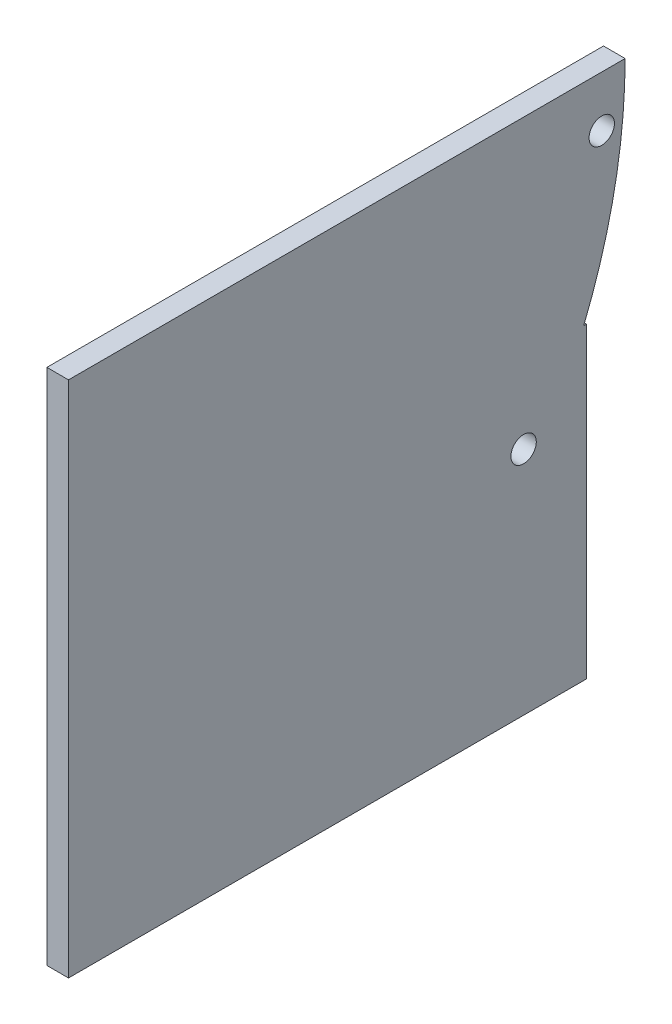
ISO-10303-21;
HEADER;
FILE_DESCRIPTION(('STEP AP214'),'2;1');
FILE_NAME('part.step','',(''),(''),'','','');
FILE_SCHEMA(('AUTOMOTIVE_DESIGN { 1 0 10303 214 1 1 1 1 }'));
ENDSEC;
DATA;
#1=APPLICATION_CONTEXT('core data for automotive mechanical design processes');
#2=APPLICATION_PROTOCOL_DEFINITION('international standard','automotive_design',2000,#1);
#3=PRODUCT_CONTEXT('',#1,'mechanical');
#4=PRODUCT('Part','Part','',(#3));
#5=PRODUCT_RELATED_PRODUCT_CATEGORY('part','',(#4));
#6=PRODUCT_DEFINITION_FORMATION('','',#4);
#7=PRODUCT_DEFINITION_CONTEXT('part definition',#1,'design');
#8=PRODUCT_DEFINITION('design','',#6,#7);
#9=PRODUCT_DEFINITION_SHAPE('','',#8);
#10=(LENGTH_UNIT() NAMED_UNIT(*) SI_UNIT(.MILLI.,.METRE.));
#11=(NAMED_UNIT(*) PLANE_ANGLE_UNIT() SI_UNIT($,.RADIAN.));
#12=(NAMED_UNIT(*) SI_UNIT($,.STERADIAN.) SOLID_ANGLE_UNIT());
#13=UNCERTAINTY_MEASURE_WITH_UNIT(LENGTH_MEASURE(1.E-05),#10,'distance_accuracy_value','');
#14=(GEOMETRIC_REPRESENTATION_CONTEXT(3) GLOBAL_UNCERTAINTY_ASSIGNED_CONTEXT((#13)) GLOBAL_UNIT_ASSIGNED_CONTEXT((#10,
#11,#12)) REPRESENTATION_CONTEXT('',''));
#15=CARTESIAN_POINT('',(0.,0.,0.));
#16=DIRECTION('',(0.,0.,1.));
#17=DIRECTION('',(1.,0.,0.));
#18=AXIS2_PLACEMENT_3D('',#15,#16,#17);
#19=CARTESIAN_POINT('',(5.4102,0.,0.));
#20=DIRECTION('',(0.,0.,-1.));
#21=DIRECTION('',(0.,1.,0.));
#22=AXIS2_PLACEMENT_3D('',#19,#20,#21);
#23=PLANE('',#22);
#24=DIRECTION('',(0.,-1.,0.));
#25=VECTOR('',#24,1.);
#26=CARTESIAN_POINT('',(0.,0.,0.));
#27=LINE('',#26,#25);
#28=CARTESIAN_POINT('',(0.,0.,0.));
#29=VERTEX_POINT('',#28);
#30=CARTESIAN_POINT('',(0.,-129.54,0.));
#31=VERTEX_POINT('',#30);
#32=EDGE_CURVE('E126',#29,#31,#27,.T.);
#33=ORIENTED_EDGE('',*,*,#32,.T.);
#34=DIRECTION('',(-1.,0.,0.));
#35=VECTOR('',#34,1.);
#36=CARTESIAN_POINT('',(5.4102,-129.54,0.));
#37=LINE('',#36,#35);
#38=CARTESIAN_POINT('',(5.4102,-129.54,0.));
#39=VERTEX_POINT('',#38);
#40=EDGE_CURVE('E11',#39,#31,#37,.T.);
#41=ORIENTED_EDGE('',*,*,#40,.F.);
#42=DIRECTION('',(0.,-1.,0.));
#43=VECTOR('',#42,1.);
#44=CARTESIAN_POINT('',(5.4102,0.,0.));
#45=LINE('',#44,#43);
#46=CARTESIAN_POINT('',(5.4102,0.,0.));
#47=VERTEX_POINT('',#46);
#48=EDGE_CURVE('E145',#47,#39,#45,.T.);
#49=ORIENTED_EDGE('',*,*,#48,.F.);
#50=DIRECTION('',(-1.,0.,0.));
#51=VECTOR('',#50,1.);
#52=CARTESIAN_POINT('',(5.4102,0.,0.));
#53=LINE('',#52,#51);
#54=EDGE_CURVE('E50',#47,#29,#53,.T.);
#55=ORIENTED_EDGE('',*,*,#54,.T.);
#56=EDGE_LOOP('',(#33,#41,#49,#55));
#57=FACE_BOUND('',#56,.T.);
#58=ADVANCED_FACE('F34',(#57),#23,.F.);
#59=CARTESIAN_POINT('',(5.4102,-129.54,0.));
#60=DIRECTION('',(0.,1.,0.));
#61=DIRECTION('',(0.,0.,1.));
#62=AXIS2_PLACEMENT_3D('',#59,#60,#61);
#63=PLANE('',#62);
#64=DIRECTION('',(0.,0.,-1.));
#65=VECTOR('',#64,1.);
#66=CARTESIAN_POINT('',(0.,-129.54,0.));
#67=LINE('',#66,#65);
#68=CARTESIAN_POINT('',(0.,-129.54,-129.54));
#69=VERTEX_POINT('',#68);
#70=EDGE_CURVE('E128',#31,#69,#67,.T.);
#71=ORIENTED_EDGE('',*,*,#70,.T.);
#72=DIRECTION('',(-1.,0.,0.));
#73=VECTOR('',#72,1.);
#74=CARTESIAN_POINT('',(5.4102,-129.54,-129.54));
#75=LINE('',#74,#73);
#76=CARTESIAN_POINT('',(5.4102,-129.54,-129.54));
#77=VERTEX_POINT('',#76);
#78=EDGE_CURVE('E42',#77,#69,#75,.T.);
#79=ORIENTED_EDGE('',*,*,#78,.F.);
#80=DIRECTION('',(0.,0.,-1.));
#81=VECTOR('',#80,1.);
#82=CARTESIAN_POINT('',(5.4102,-129.54,0.));
#83=LINE('',#82,#81);
#84=EDGE_CURVE('E83',#39,#77,#83,.T.);
#85=ORIENTED_EDGE('',*,*,#84,.F.);
#86=ORIENTED_EDGE('',*,*,#40,.T.);
#87=EDGE_LOOP('',(#71,#79,#85,#86));
#88=FACE_BOUND('',#87,.T.);
#89=ADVANCED_FACE('F170',(#88),#63,.F.);
#90=CARTESIAN_POINT('',(5.4102,0.,-129.54));
#91=DIRECTION('',(0.,0.,1.));
#92=DIRECTION('',(1.,0.,0.));
#93=AXIS2_PLACEMENT_3D('',#90,#91,#92);
#94=PLANE('',#93);
#95=DIRECTION('',(0.,1.,0.));
#96=VECTOR('',#95,1.);
#97=CARTESIAN_POINT('',(0.,0.,-129.54));
#98=LINE('',#97,#96);
#99=CARTESIAN_POINT('',(0.,-52.681426172974,-129.54));
#100=VERTEX_POINT('',#99);
#101=EDGE_CURVE('E130',#69,#100,#98,.T.);
#102=ORIENTED_EDGE('',*,*,#101,.T.);
#103=DIRECTION('',(-1.,0.,0.));
#104=VECTOR('',#103,1.);
#105=CARTESIAN_POINT('',(5.4102,-52.681426172974,-129.54));
#106=LINE('',#105,#104);
#107=CARTESIAN_POINT('',(5.4102,-52.681426172974,-129.54));
#108=VERTEX_POINT('',#107);
#109=EDGE_CURVE('E102',#108,#100,#106,.T.);
#110=ORIENTED_EDGE('',*,*,#109,.F.);
#111=DIRECTION('',(0.,1.,0.));
#112=VECTOR('',#111,1.);
#113=CARTESIAN_POINT('',(5.4102,0.,-129.54));
#114=LINE('',#113,#112);
#115=EDGE_CURVE('E113',#77,#108,#114,.T.);
#116=ORIENTED_EDGE('',*,*,#115,.F.);
#117=ORIENTED_EDGE('',*,*,#78,.T.);
#118=EDGE_LOOP('',(#102,#110,#116,#117));
#119=FACE_BOUND('',#118,.T.);
#120=ADVANCED_FACE('F151',(#119),#94,.F.);
#121=CARTESIAN_POINT('',(5.4102,-52.681426172974,0.));
#122=DIRECTION('',(0.,1.,0.));
#123=DIRECTION('',(0.,0.,1.));
#124=AXIS2_PLACEMENT_3D('',#121,#122,#123);
#125=PLANE('',#124);
#126=DIRECTION('',(0.,0.,-1.));
#127=VECTOR('',#126,1.);
#128=CARTESIAN_POINT('',(0.,-52.681426172974,0.));
#129=LINE('',#128,#127);
#130=CARTESIAN_POINT('',(0.,-52.681426172974,-128.837417703016));
#131=VERTEX_POINT('',#130);
#132=EDGE_CURVE('E99',#131,#100,#129,.T.);
#133=ORIENTED_EDGE('',*,*,#132,.F.);
#134=DIRECTION('',(-1.,0.,0.));
#135=VECTOR('',#134,1.);
#136=CARTESIAN_POINT('',(5.4102,-52.681426172974,-128.837417703016));
#137=LINE('',#136,#135);
#138=CARTESIAN_POINT('',(5.4102,-52.681426172974,-128.837417703016));
#139=VERTEX_POINT('',#138);
#140=EDGE_CURVE('E93',#139,#131,#137,.T.);
#141=ORIENTED_EDGE('',*,*,#140,.F.);
#142=DIRECTION('',(0.,0.,-1.));
#143=VECTOR('',#142,1.);
#144=CARTESIAN_POINT('',(5.4102,-52.681426172974,0.));
#145=LINE('',#144,#143);
#146=EDGE_CURVE('E97',#139,#108,#145,.T.);
#147=ORIENTED_EDGE('',*,*,#146,.T.);
#148=ORIENTED_EDGE('',*,*,#109,.T.);
#149=EDGE_LOOP('',(#133,#141,#147,#148));
#150=FACE_BOUND('',#149,.T.);
#151=ADVANCED_FACE('F95',(#150),#125,.T.);
#152=CARTESIAN_POINT('',(5.4102,0.,0.));
#153=DIRECTION('',(-1.,0.,0.));
#154=DIRECTION('',(0.,0.,1.));
#155=AXIS2_PLACEMENT_3D('',#152,#153,#154);
#156=CYLINDRICAL_SURFACE('',#155,139.192);
#157=CARTESIAN_POINT('',(0.,0.,0.));
#158=DIRECTION('',(1.,0.,0.));
#159=DIRECTION('',(0.,0.,-1.));
#160=AXIS2_PLACEMENT_3D('',#157,#158,#159);
#161=CIRCLE('',#160,139.192);
#162=CARTESIAN_POINT('',(0.,0.,-139.192));
#163=VERTEX_POINT('',#162);
#164=EDGE_CURVE('E134',#131,#163,#161,.T.);
#165=ORIENTED_EDGE('',*,*,#164,.T.);
#166=DIRECTION('',(-1.,0.,0.));
#167=VECTOR('',#166,1.);
#168=CARTESIAN_POINT('',(5.4102,0.,-139.192));
#169=LINE('',#168,#167);
#170=CARTESIAN_POINT('',(5.4102,0.,-139.192));
#171=VERTEX_POINT('',#170);
#172=EDGE_CURVE('E71',#171,#163,#169,.T.);
#173=ORIENTED_EDGE('',*,*,#172,.F.);
#174=CARTESIAN_POINT('',(5.4102,0.,0.));
#175=DIRECTION('',(1.,0.,0.));
#176=DIRECTION('',(0.,0.,-1.));
#177=AXIS2_PLACEMENT_3D('',#174,#175,#176);
#178=CIRCLE('',#177,139.192);
#179=EDGE_CURVE('E104',#139,#171,#178,.T.);
#180=ORIENTED_EDGE('',*,*,#179,.F.);
#181=ORIENTED_EDGE('',*,*,#140,.T.);
#182=EDGE_LOOP('',(#165,#173,#180,#181));
#183=FACE_BOUND('',#182,.T.);
#184=ADVANCED_FACE('F105',(#183),#156,.T.);
#185=CARTESIAN_POINT('',(5.4102,-12.7,-133.35));
#186=DIRECTION('',(-1.,0.,0.));
#187=DIRECTION('',(0.,0.,1.));
#188=AXIS2_PLACEMENT_3D('',#185,#186,#187);
#189=CYLINDRICAL_SURFACE('',#188,3.175);
#190=CARTESIAN_POINT('',(5.4102,-12.7,-133.35));
#191=DIRECTION('',(1.,0.,0.));
#192=DIRECTION('',(0.,0.,-1.));
#193=AXIS2_PLACEMENT_3D('',#190,#191,#192);
#194=CIRCLE('',#193,3.175);
#195=CARTESIAN_POINT('',(5.4102,-12.7,-136.525));
#196=VERTEX_POINT('',#195);
#197=EDGE_CURVE('E120',#196,#196,#194,.T.);
#198=ORIENTED_EDGE('',*,*,#197,.T.);
#199=EDGE_LOOP('',(#198));
#200=FACE_BOUND('',#199,.T.);
#201=CARTESIAN_POINT('',(0.,-12.7,-133.35));
#202=DIRECTION('',(1.,0.,0.));
#203=DIRECTION('',(0.,0.,-1.));
#204=AXIS2_PLACEMENT_3D('',#201,#202,#203);
#205=CIRCLE('',#204,3.175);
#206=CARTESIAN_POINT('',(0.,-12.7,-136.525));
#207=VERTEX_POINT('',#206);
#208=EDGE_CURVE('E139',#207,#207,#205,.T.);
#209=ORIENTED_EDGE('',*,*,#208,.F.);
#210=EDGE_LOOP('',(#209));
#211=FACE_BOUND('',#210,.T.);
#212=ADVANCED_FACE('F158',(#200,#211),#189,.F.);
#213=CARTESIAN_POINT('',(5.4102,0.,0.));
#214=DIRECTION('',(0.,1.,0.));
#215=DIRECTION('',(0.,0.,1.));
#216=AXIS2_PLACEMENT_3D('',#213,#214,#215);
#217=PLANE('',#216);
#218=DIRECTION('',(0.,0.,-1.));
#219=VECTOR('',#218,1.);
#220=CARTESIAN_POINT('',(0.,0.,0.));
#221=LINE('',#220,#219);
#222=EDGE_CURVE('E136',#29,#163,#221,.T.);
#223=ORIENTED_EDGE('',*,*,#222,.F.);
#224=ORIENTED_EDGE('',*,*,#54,.F.);
#225=DIRECTION('',(0.,0.,-1.));
#226=VECTOR('',#225,1.);
#227=CARTESIAN_POINT('',(5.4102,0.,0.));
#228=LINE('',#227,#226);
#229=EDGE_CURVE('E108',#47,#171,#228,.T.);
#230=ORIENTED_EDGE('',*,*,#229,.T.);
#231=ORIENTED_EDGE('',*,*,#172,.T.);
#232=EDGE_LOOP('',(#223,#224,#230,#231));
#233=FACE_BOUND('',#232,.T.);
#234=ADVANCED_FACE('F155',(#233),#217,.T.);
#235=CARTESIAN_POINT('',(5.4102,-71.9099026378632,-113.804702462653));
#236=DIRECTION('',(-1.,0.,0.));
#237=DIRECTION('',(0.,0.,1.));
#238=AXIS2_PLACEMENT_3D('',#235,#236,#237);
#239=CYLINDRICAL_SURFACE('',#238,3.175);
#240=CARTESIAN_POINT('',(5.4102,-71.9099026378632,-113.804702462653));
#241=DIRECTION('',(1.,0.,0.));
#242=DIRECTION('',(0.,0.,-1.));
#243=AXIS2_PLACEMENT_3D('',#240,#241,#242);
#244=CIRCLE('',#243,3.175);
#245=CARTESIAN_POINT('',(5.4102,-71.9099026378632,-116.979702462653));
#246=VERTEX_POINT('',#245);
#247=EDGE_CURVE('E123',#246,#246,#244,.T.);
#248=ORIENTED_EDGE('',*,*,#247,.T.);
#249=EDGE_LOOP('',(#248));
#250=FACE_BOUND('',#249,.T.);
#251=CARTESIAN_POINT('',(0.,-71.9099026378632,-113.804702462653));
#252=DIRECTION('',(1.,0.,0.));
#253=DIRECTION('',(0.,0.,-1.));
#254=AXIS2_PLACEMENT_3D('',#251,#252,#253);
#255=CIRCLE('',#254,3.175);
#256=CARTESIAN_POINT('',(0.,-71.9099026378632,-116.979702462653));
#257=VERTEX_POINT('',#256);
#258=EDGE_CURVE('E142',#257,#257,#255,.T.);
#259=ORIENTED_EDGE('',*,*,#258,.F.);
#260=EDGE_LOOP('',(#259));
#261=FACE_BOUND('',#260,.T.);
#262=ADVANCED_FACE('F157',(#250,#261),#239,.F.);
#263=CARTESIAN_POINT('',(5.4102,0.,0.));
#264=DIRECTION('',(1.,0.,0.));
#265=DIRECTION('',(0.,0.,-1.));
#266=AXIS2_PLACEMENT_3D('',#263,#264,#265);
#267=PLANE('',#266);
#268=ORIENTED_EDGE('',*,*,#48,.T.);
#269=ORIENTED_EDGE('',*,*,#84,.T.);
#270=ORIENTED_EDGE('',*,*,#115,.T.);
#271=ORIENTED_EDGE('',*,*,#146,.F.);
#272=ORIENTED_EDGE('',*,*,#179,.T.);
#273=ORIENTED_EDGE('',*,*,#229,.F.);
#274=EDGE_LOOP('',(#268,#269,#270,#271,#272,#273));
#275=FACE_BOUND('',#274,.T.);
#276=ORIENTED_EDGE('',*,*,#197,.F.);
#277=EDGE_LOOP('',(#276));
#278=FACE_BOUND('',#277,.T.);
#279=ORIENTED_EDGE('',*,*,#247,.F.);
#280=EDGE_LOOP('',(#279));
#281=FACE_BOUND('',#280,.T.);
#282=ADVANCED_FACE('F110',(#275,#278,#281),#267,.T.);
#283=CARTESIAN_POINT('',(0.,0.,0.));
#284=DIRECTION('',(1.,0.,0.));
#285=DIRECTION('',(0.,0.,-1.));
#286=AXIS2_PLACEMENT_3D('',#283,#284,#285);
#287=PLANE('',#286);
#288=ORIENTED_EDGE('',*,*,#32,.F.);
#289=ORIENTED_EDGE('',*,*,#222,.T.);
#290=ORIENTED_EDGE('',*,*,#164,.F.);
#291=ORIENTED_EDGE('',*,*,#132,.T.);
#292=ORIENTED_EDGE('',*,*,#101,.F.);
#293=ORIENTED_EDGE('',*,*,#70,.F.);
#294=EDGE_LOOP('',(#288,#289,#290,#291,#292,#293));
#295=FACE_BOUND('',#294,.T.);
#296=ORIENTED_EDGE('',*,*,#208,.T.);
#297=EDGE_LOOP('',(#296));
#298=FACE_BOUND('',#297,.T.);
#299=ORIENTED_EDGE('',*,*,#258,.T.);
#300=EDGE_LOOP('',(#299));
#301=FACE_BOUND('',#300,.T.);
#302=ADVANCED_FACE('F153',(#295,#298,#301),#287,.F.);
#303=CLOSED_SHELL('',(#58,#89,#120,#151,#184,#212,#234,#262,#282,#302));
#304=MANIFOLD_SOLID_BREP('B2',#303);
#305=ADVANCED_BREP_SHAPE_REPRESENTATION('',(#18,#304),#14);
#306=SHAPE_DEFINITION_REPRESENTATION(#9,#305);
ENDSEC;
END-ISO-10303-21;
